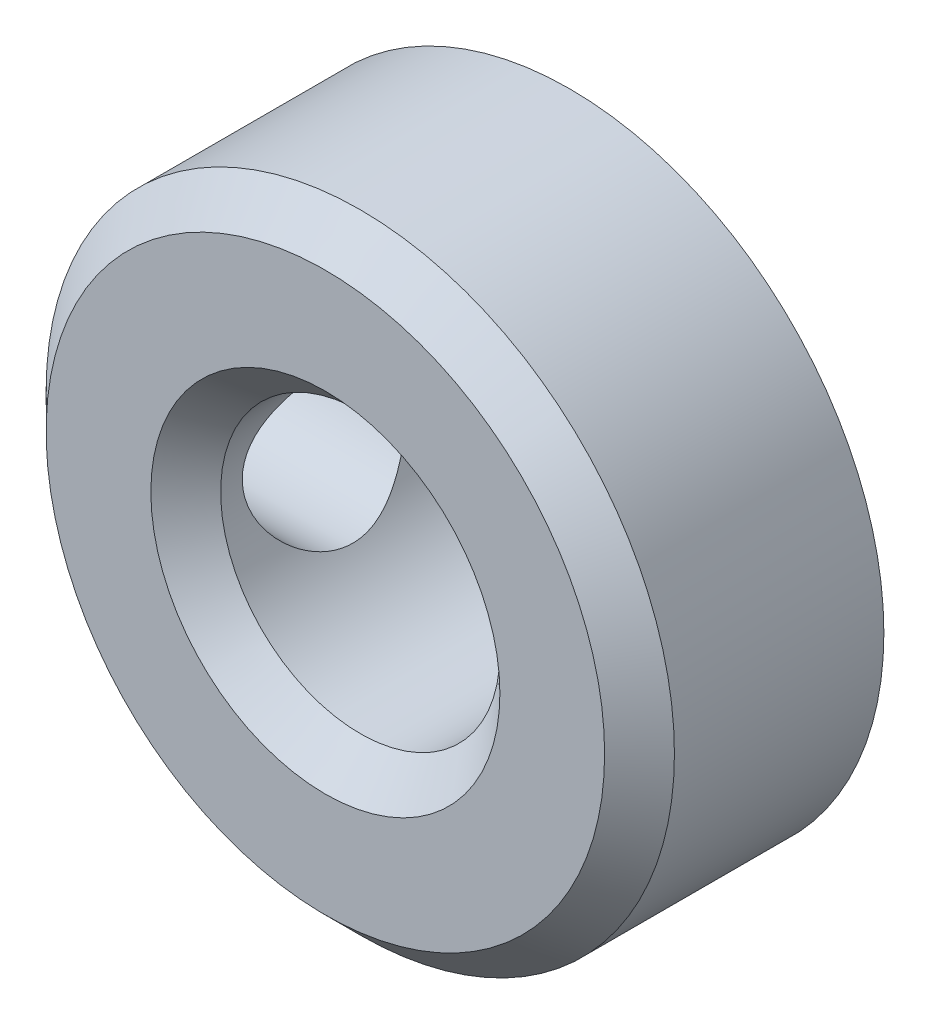
ISO-10303-21;
HEADER;
FILE_DESCRIPTION(('STEP AP214'),'2;1');
FILE_NAME('part.step','',(''),(''),'','','');
FILE_SCHEMA(('AUTOMOTIVE_DESIGN { 1 0 10303 214 1 1 1 1 }'));
ENDSEC;
DATA;
#1=APPLICATION_CONTEXT('core data for automotive mechanical design processes');
#2=APPLICATION_PROTOCOL_DEFINITION('international standard','automotive_design',2000,#1);
#3=PRODUCT_CONTEXT('',#1,'mechanical');
#4=PRODUCT('Part','Part','',(#3));
#5=PRODUCT_RELATED_PRODUCT_CATEGORY('part','',(#4));
#6=PRODUCT_DEFINITION_FORMATION('','',#4);
#7=PRODUCT_DEFINITION_CONTEXT('part definition',#1,'design');
#8=PRODUCT_DEFINITION('design','',#6,#7);
#9=PRODUCT_DEFINITION_SHAPE('','',#8);
#10=(LENGTH_UNIT() NAMED_UNIT(*) SI_UNIT(.MILLI.,.METRE.));
#11=(NAMED_UNIT(*) PLANE_ANGLE_UNIT() SI_UNIT($,.RADIAN.));
#12=(NAMED_UNIT(*) SI_UNIT($,.STERADIAN.) SOLID_ANGLE_UNIT());
#13=UNCERTAINTY_MEASURE_WITH_UNIT(LENGTH_MEASURE(1.E-05),#10,'distance_accuracy_value','');
#14=(GEOMETRIC_REPRESENTATION_CONTEXT(3) GLOBAL_UNCERTAINTY_ASSIGNED_CONTEXT((#13)) GLOBAL_UNIT_ASSIGNED_CONTEXT((#10,
#11,#12)) REPRESENTATION_CONTEXT('',''));
#15=CARTESIAN_POINT('',(0.,0.,0.));
#16=DIRECTION('',(0.,0.,1.));
#17=DIRECTION('',(1.,0.,0.));
#18=AXIS2_PLACEMENT_3D('',#15,#16,#17);
#19=CARTESIAN_POINT('',(0.,0.,8.));
#20=DIRECTION('',(0.,0.,-1.));
#21=DIRECTION('',(-1.,0.,0.));
#22=AXIS2_PLACEMENT_3D('',#19,#20,#21);
#23=CYLINDRICAL_SURFACE('',#22,9.);
#24=CARTESIAN_POINT('',(0.,0.,6.99999999999999));
#25=DIRECTION('',(0.,0.,1.));
#26=DIRECTION('',(1.,0.,0.));
#27=AXIS2_PLACEMENT_3D('',#24,#25,#26);
#28=CIRCLE('',#27,9.);
#29=CARTESIAN_POINT('',(9.,0.,6.99999999999999));
#30=VERTEX_POINT('',#29);
#31=EDGE_CURVE('E10',#30,#30,#28,.F.);
#32=ORIENTED_EDGE('',*,*,#31,.T.);
#33=EDGE_LOOP('',(#32));
#34=FACE_BOUND('',#33,.T.);
#35=CARTESIAN_POINT('',(-9.,0.,6.38125));
#36=CARTESIAN_POINT('',(-8.99999798467923,-0.131309512700447,6.38124680600626));
#37=CARTESIAN_POINT('',(-8.99709797693568,-0.262653431981833,6.37035235001869));
#38=CARTESIAN_POINT('',(-8.98581083004397,-0.521560103785591,6.32713797945013));
#39=CARTESIAN_POINT('',(-8.97742099033645,-0.649120963044646,6.2948075199616));
#40=CARTESIAN_POINT('',(-8.95608058484247,-0.896686674551814,6.20984396750576));
#41=CARTESIAN_POINT('',(-8.94313584980798,-1.01670095679463,6.15723682268507));
#42=CARTESIAN_POINT('',(-8.91405503505782,-1.24620286456261,6.03330879169303));
#43=CARTESIAN_POINT('',(-8.89791875589815,-1.35568983158557,5.96198673591009));
#44=CARTESIAN_POINT('',(-8.86378587503302,-1.56353159494066,5.80093229414223));
#45=CARTESIAN_POINT('',(-8.84575786636026,-1.66161149651998,5.71085180228003));
#46=CARTESIAN_POINT('',(-8.81007595044559,-1.84146318742849,5.51558183402106));
#47=CARTESIAN_POINT('',(-8.79242209082722,-1.92323291172778,5.41039044733199));
#48=CARTESIAN_POINT('',(-8.75916663935108,-2.06947735177871,5.18569812037626));
#49=CARTESIAN_POINT('',(-8.74360470478374,-2.13363694374975,5.06598566916805));
#50=CARTESIAN_POINT('',(-8.71675637581681,-2.24081055932566,4.81699475981791));
#51=CARTESIAN_POINT('',(-8.70546920674695,-2.2838284146436,4.68771803998729));
#52=CARTESIAN_POINT('',(-8.68877245569261,-2.34654490217524,4.42630996317418));
#53=CARTESIAN_POINT('',(-8.68323760502427,-2.36674141004057,4.29430625042168));
#54=CARTESIAN_POINT('',(-8.67829781106524,-2.38479392005639,4.02867712268295));
#55=CARTESIAN_POINT('',(-8.6788917416541,-2.3826540263627,3.89505201012428));
#56=CARTESIAN_POINT('',(-8.68603022260516,-2.3564899925805,3.63385019360108));
#57=CARTESIAN_POINT('',(-8.69241127288658,-2.33306711386461,3.50620808516409));
#58=CARTESIAN_POINT('',(-8.71014337361605,-2.26596450264241,3.25673312843764));
#59=CARTESIAN_POINT('',(-8.72149481576193,-2.22228317362796,3.13490073882947));
#60=CARTESIAN_POINT('',(-8.74803325290006,-2.11541080670698,2.89893057400899));
#61=CARTESIAN_POINT('',(-8.76326153222618,-2.05200803264609,2.7848935344326));
#62=CARTESIAN_POINT('',(-8.79581546551979,-1.90764030861978,2.56886549653931));
#63=CARTESIAN_POINT('',(-8.81314152624478,-1.82667195028932,2.46687684198957));
#64=CARTESIAN_POINT('',(-8.84862038992559,-1.64639200625548,2.27440406675599));
#65=CARTESIAN_POINT('',(-8.86678188179102,-1.54657519157148,2.18439411477061));
#66=CARTESIAN_POINT('',(-8.90138635754901,-1.33304239063562,2.0222948209667));
#67=CARTESIAN_POINT('',(-8.91782927577002,-1.21932587359689,1.95020616382641));
#68=CARTESIAN_POINT('',(-8.94724248983319,-0.980494779368565,1.82579151348282));
#69=CARTESIAN_POINT('',(-8.96019783897886,-0.855334129185483,1.77355019916559));
#70=CARTESIAN_POINT('',(-8.98106808625492,-0.597586038622827,1.69098629199859));
#71=CARTESIAN_POINT('',(-8.98898406806392,-0.465000201651199,1.66065898651394));
#72=CARTESIAN_POINT('',(-8.99872023089597,-0.20021295708475,1.62352587102549));
#73=CARTESIAN_POINT('',(-9.00070747280843,-0.068107981782415,1.6160752571067));
#74=CARTESIAN_POINT('',(-8.9988419816029,0.195463543692784,1.62312787560673));
#75=CARTESIAN_POINT('',(-8.99498984200853,0.326930157387207,1.63762887682974));
#76=CARTESIAN_POINT('',(-8.98198621698853,0.583199495276736,1.68764385874222));
#77=CARTESIAN_POINT('',(-8.97292523384685,0.708077226764481,1.72279919971514));
#78=CARTESIAN_POINT('',(-8.95053084454883,0.950151409827949,1.81270933541478));
#79=CARTESIAN_POINT('',(-8.93719697916367,1.06734703413621,1.86746623689703));
#80=CARTESIAN_POINT('',(-8.90734330517237,1.29324342410255,1.99622801978617));
#81=CARTESIAN_POINT('',(-8.89076681518221,1.40173580723558,2.07058501343687));
#82=CARTESIAN_POINT('',(-8.85634456348238,1.60492974163901,2.23599265359204));
#83=CARTESIAN_POINT('',(-8.83849855552232,1.6996286064433,2.32704654425329));
#84=CARTESIAN_POINT('',(-8.80293565173746,1.87525684150852,2.52627056092894));
#85=CARTESIAN_POINT('',(-8.78523605750331,1.95573158900402,2.63484528859086));
#86=CARTESIAN_POINT('',(-8.7525150009675,2.09732748014895,2.86433116060466));
#87=CARTESIAN_POINT('',(-8.73749342563698,2.15844944068966,2.985241783967));
#88=CARTESIAN_POINT('',(-8.71200120348031,2.25914459567467,3.23535666717522));
#89=CARTESIAN_POINT('',(-8.70150415364431,2.29884315939881,3.36450761797379));
#90=CARTESIAN_POINT('',(-8.68624103586922,2.35586598469381,3.62797610979553));
#91=CARTESIAN_POINT('',(-8.68147353110169,2.37319585586117,3.76229234676944));
#92=CARTESIAN_POINT('',(-8.67832799191096,2.38467041189116,4.02762793960445));
#93=CARTESIAN_POINT('',(-8.67974872878607,2.37954525488502,4.15861381066844));
#94=CARTESIAN_POINT('',(-8.68834921073481,2.34794604924517,4.41778207710616));
#95=CARTESIAN_POINT('',(-8.69552881196033,2.32147253386245,4.54596454242275));
#96=CARTESIAN_POINT('',(-8.7147192453937,2.24834834971492,4.79498445190391));
#97=CARTESIAN_POINT('',(-8.72669352970157,2.20185012304782,4.91586967440696));
#98=CARTESIAN_POINT('',(-8.75412553000923,2.09011504599893,5.14821395753877));
#99=CARTESIAN_POINT('',(-8.76958378451468,2.02487529837419,5.25967155730468));
#100=CARTESIAN_POINT('',(-8.8028020040912,1.87528643544959,5.47348752758714));
#101=CARTESIAN_POINT('',(-8.82061572187863,1.79043797691884,5.57548824582294));
#102=CARTESIAN_POINT('',(-8.85623493459799,1.60499290307578,5.76404097113531));
#103=CARTESIAN_POINT('',(-8.87404042649127,1.50439247658211,5.85058922862152));
#104=CARTESIAN_POINT('',(-8.90808314195951,1.28775471068826,6.00756161823786));
#105=CARTESIAN_POINT('',(-8.92427967284217,1.17143801219426,6.07760977086511));
#106=CARTESIAN_POINT('',(-8.95283657162124,0.928255978318962,6.19704710707584));
#107=CARTESIAN_POINT('',(-8.96519943695932,0.801397578926832,6.24644974750413));
#108=CARTESIAN_POINT('',(-8.98306775789566,0.562481525950002,6.31663518079908));
#109=CARTESIAN_POINT('',(-8.98937142182208,0.451468120319509,6.3408099679094));
#110=CARTESIAN_POINT('',(-8.99783821620418,0.226978221393998,6.37311799207626));
#111=CARTESIAN_POINT('',(-9.00000174201291,0.113501964330082,6.38125276084006));
#112=CARTESIAN_POINT('',(-9.,0.,6.38125));
#113=B_SPLINE_CURVE_WITH_KNOTS('',3,(#35,#36,#37,#38,#39,#40,#41,#42,#43,#44,#45,#46,#47,#48,
#49,#50,#51,#52,#53,#54,#55,#56,#57,#58,#59,#60,#61,#62,#63,#64,#65,#66,#67,#68,#69,#70,#71,#72,
#73,#74,#75,#76,#77,#78,#79,#80,#81,#82,#83,#84,#85,#86,#87,#88,#89,#90,#91,#92,#93,#94,#95,#96,
#97,#98,#99,#100,#101,#102,#103,#104,#105,#106,#107,#108,#109,#110,#111,#112),.UNSPECIFIED.,.T.,
.F.,(4,2,2,2,2,2,2,2,2,2,2,2,2,2,2,2,2,2,2,2,2,2,2,2,2,2,2,2,2,2,2,2,2,2,2,2,2,2,4),(0.,
0.393512335658052,0.787218393665488,1.1804222884957,1.57365076294676,1.97495736628762,
2.37631474681103,2.78444473903164,3.19250073476444,3.59147139424993,3.99036874698892,
4.37833583226254,4.76633349726327,5.15864966422587,5.55104202305077,5.9560254601377,
6.36102436713076,6.76773230312079,7.17435275001183,7.56940177878034,7.96441065685605,
8.35275529770095,8.74114168996564,9.13704712407248,9.53302956307465,9.93999208955149,
10.3469374356362,10.7514747851796,11.1559106655611,11.5472950577035,11.9386696739347,
12.3271161272502,12.7156226626657,13.1153968559042,13.5152679242126,13.9235201952973,
14.3315059489639,14.6716845690367,15.0118307029059),.UNSPECIFIED.);
#114=CARTESIAN_POINT('',(-9.,0.,6.38125));
#115=VERTEX_POINT('',#114);
#116=EDGE_CURVE('E53',#115,#115,#113,.T.);
#117=ORIENTED_EDGE('',*,*,#116,.T.);
#118=EDGE_LOOP('',(#117));
#119=FACE_BOUND('',#118,.T.);
#120=CARTESIAN_POINT('',(0.,0.,1.));
#121=DIRECTION('',(0.,0.,-1.));
#122=DIRECTION('',(-1.,0.,0.));
#123=AXIS2_PLACEMENT_3D('',#120,#121,#122);
#124=CIRCLE('',#123,9.);
#125=CARTESIAN_POINT('',(-9.,0.,1.));
#126=VERTEX_POINT('',#125);
#127=EDGE_CURVE('E35',#126,#126,#124,.T.);
#128=ORIENTED_EDGE('',*,*,#127,.F.);
#129=EDGE_LOOP('',(#128));
#130=FACE_BOUND('',#129,.T.);
#131=ADVANCED_FACE('F31',(#34,#119,#130),#23,.T.);
#132=CARTESIAN_POINT('',(0.,0.,0.));
#133=DIRECTION('',(0.,0.,1.));
#134=DIRECTION('',(1.,0.,0.));
#135=AXIS2_PLACEMENT_3D('',#132,#133,#134);
#136=PLANE('',#135);
#137=CARTESIAN_POINT('',(0.,0.,0.));
#138=DIRECTION('',(0.,0.,1.));
#139=DIRECTION('',(1.,0.,0.));
#140=AXIS2_PLACEMENT_3D('',#137,#138,#139);
#141=CIRCLE('',#140,4.);
#142=CARTESIAN_POINT('',(4.,0.,0.));
#143=VERTEX_POINT('',#142);
#144=EDGE_CURVE('E72',#143,#143,#141,.T.);
#145=ORIENTED_EDGE('',*,*,#144,.T.);
#146=EDGE_LOOP('',(#145));
#147=FACE_BOUND('',#146,.T.);
#148=CARTESIAN_POINT('',(0.,0.,0.));
#149=DIRECTION('',(0.,0.,-1.));
#150=DIRECTION('',(-1.,0.,0.));
#151=AXIS2_PLACEMENT_3D('',#148,#149,#150);
#152=CIRCLE('',#151,5.5);
#153=CARTESIAN_POINT('',(-5.5,0.,0.));
#154=VERTEX_POINT('',#153);
#155=EDGE_CURVE('E73',#154,#154,#152,.T.);
#156=ORIENTED_EDGE('',*,*,#155,.T.);
#157=EDGE_LOOP('',(#156));
#158=FACE_BOUND('',#157,.T.);
#159=ADVANCED_FACE('F79',(#147,#158),#136,.F.);
#160=CARTESIAN_POINT('',(0.,0.,8.));
#161=DIRECTION('',(0.,0.,1.));
#162=DIRECTION('',(1.,0.,0.));
#163=AXIS2_PLACEMENT_3D('',#160,#161,#162);
#164=PLANE('',#163);
#165=CARTESIAN_POINT('',(0.,0.,8.));
#166=DIRECTION('',(0.,0.,1.));
#167=DIRECTION('',(1.,0.,0.));
#168=AXIS2_PLACEMENT_3D('',#165,#166,#167);
#169=CIRCLE('',#168,5.);
#170=CARTESIAN_POINT('',(5.,0.,8.));
#171=VERTEX_POINT('',#170);
#172=EDGE_CURVE('E39',#171,#171,#169,.F.);
#173=ORIENTED_EDGE('',*,*,#172,.T.);
#174=EDGE_LOOP('',(#173));
#175=FACE_BOUND('',#174,.T.);
#176=CARTESIAN_POINT('',(0.,0.,8.));
#177=DIRECTION('',(0.,0.,1.));
#178=DIRECTION('',(1.,0.,0.));
#179=AXIS2_PLACEMENT_3D('',#176,#177,#178);
#180=CIRCLE('',#179,8.);
#181=CARTESIAN_POINT('',(8.,0.,8.));
#182=VERTEX_POINT('',#181);
#183=EDGE_CURVE('E44',#182,#182,#180,.T.);
#184=ORIENTED_EDGE('',*,*,#183,.T.);
#185=EDGE_LOOP('',(#184));
#186=FACE_BOUND('',#185,.T.);
#187=ADVANCED_FACE('F88',(#175,#186),#164,.T.);
#188=CARTESIAN_POINT('',(0.,0.,0.));
#189=DIRECTION('',(0.,0.,1.));
#190=DIRECTION('',(1.,0.,0.));
#191=AXIS2_PLACEMENT_3D('',#188,#189,#190);
#192=CYLINDRICAL_SURFACE('',#191,4.);
#193=CARTESIAN_POINT('',(-4.,0.,1.61875));
#194=CARTESIAN_POINT('',(-3.99999369378841,-0.121958600225183,1.61875698322153));
#195=CARTESIAN_POINT('',(-3.99436069014862,-0.244125117407285,1.62818592464262));
#196=CARTESIAN_POINT('',(-3.97236243725251,-0.484793925786397,1.66542654434116));
#197=CARTESIAN_POINT('',(-3.95596967668415,-0.603286006399093,1.69328534684155));
#198=CARTESIAN_POINT('',(-3.91411438809382,-0.832602961721493,1.76583043471108));
#199=CARTESIAN_POINT('',(-3.88869681963782,-0.943462648203384,1.81043336658574));
#200=CARTESIAN_POINT('',(-3.83096469095443,-1.15578153768284,1.91468884699302));
#201=CARTESIAN_POINT('',(-3.79865202527439,-1.25724331195962,1.97433726233655));
#202=CARTESIAN_POINT('',(-3.72697995714876,-1.45659579177148,2.11202473230114));
#203=CARTESIAN_POINT('',(-3.68727205516771,-1.55363272540422,2.19111513925831));
#204=CARTESIAN_POINT('',(-3.60602212206654,-1.73389827955767,2.36308361960366));
#205=CARTESIAN_POINT('',(-3.56447781002765,-1.81710908031897,2.45597919822147));
#206=CARTESIAN_POINT('',(-3.47832030641693,-1.97750527558543,2.66608145821015));
#207=CARTESIAN_POINT('',(-3.43393897531166,-2.05276228028645,2.78486831925077));
#208=CARTESIAN_POINT('',(-3.35334059339849,-2.18195565280467,3.03601018241924));
#209=CARTESIAN_POINT('',(-3.31711045520674,-2.23592630401134,3.16834293116548));
#210=CARTESIAN_POINT('',(-3.26595956395419,-2.30976739524217,3.41065538436466));
#211=CARTESIAN_POINT('',(-3.24801878828201,-2.33469783255785,3.51845315718316));
#212=CARTESIAN_POINT('',(-3.22283819757894,-2.36934402765734,3.7376405962254));
#213=CARTESIAN_POINT('',(-3.2155853978142,-2.37907824805521,3.84902573571093));
#214=CARTESIAN_POINT('',(-3.21284875339884,-2.38277374175419,4.07241267826898));
#215=CARTESIAN_POINT('',(-3.21738672407944,-2.37670577774219,4.18441524126434));
#216=CARTESIAN_POINT('',(-3.2375797595125,-2.34911771373285,4.40549882301283));
#217=CARTESIAN_POINT('',(-3.25324307317872,-2.32758614807703,4.51457761161286));
#218=CARTESIAN_POINT('',(-3.2933070673423,-2.27053105779421,4.72587617289746));
#219=CARTESIAN_POINT('',(-3.31760725149628,-2.23516801590084,4.82815941007846));
#220=CARTESIAN_POINT('',(-3.37231704842719,-2.15173440750367,5.02561872879113));
#221=CARTESIAN_POINT('',(-3.40272891630919,-2.10365914833893,5.12079216909798));
#222=CARTESIAN_POINT('',(-3.47257750699471,-1.98660680167754,5.31877027959702));
#223=CARTESIAN_POINT('',(-3.51266609389823,-1.91545474640143,5.42005967193438));
#224=CARTESIAN_POINT('',(-3.59378713886517,-1.75855157937792,5.61030066784138));
#225=CARTESIAN_POINT('',(-3.63482045275766,-1.67278674054539,5.69924052649576));
#226=CARTESIAN_POINT('',(-3.71973092620467,-1.47534894296906,5.87440281104479));
#227=CARTESIAN_POINT('',(-3.76324489266786,-1.36174169352291,5.95863979168564));
#228=CARTESIAN_POINT('',(-3.84232965901654,-1.11923308120515,6.1065995006607));
#229=CARTESIAN_POINT('',(-3.87790486307723,-0.990340259375996,6.17033361205048));
#230=CARTESIAN_POINT('',(-3.92121599187469,-0.792634721214294,6.2464796723261));
#231=CARTESIAN_POINT('',(-3.93369870132938,-0.728301213430327,6.26816483818487));
#232=CARTESIAN_POINT('',(-3.95566759597619,-0.597556788482511,6.30605715237176));
#233=CARTESIAN_POINT('',(-3.96515544790605,-0.531147049509393,6.32226734805563));
#234=CARTESIAN_POINT('',(-3.98083896071931,-0.396846957978224,6.34894591835822));
#235=CARTESIAN_POINT('',(-3.98703693767864,-0.328957682162555,6.35941833254974));
#236=CARTESIAN_POINT('',(-3.99596140180067,-0.192326797785503,6.37446683071159));
#237=CARTESIAN_POINT('',(-3.99868835946514,-0.123585306019062,6.37904371383084));
#238=CARTESIAN_POINT('',(-4.00124862215164,0.0645145581396675,6.38335247969909));
#239=CARTESIAN_POINT('',(-3.99750831681022,0.184132610787516,6.37709499684331));
#240=CARTESIAN_POINT('',(-3.97963074684662,0.420228505541418,6.34690266304553));
#241=CARTESIAN_POINT('',(-3.9654936181476,0.536706388679926,6.32296804320607));
#242=CARTESIAN_POINT('',(-3.92855829840756,0.760964723234018,6.2593307654475));
#243=CARTESIAN_POINT('',(-3.90595567636818,0.868879439045431,6.21998329668703));
#244=CARTESIAN_POINT('',(-3.85389301833341,1.07656350381283,6.12704534512903));
#245=CARTESIAN_POINT('',(-3.82443158507388,1.17633118746927,6.07345195986431));
#246=CARTESIAN_POINT('',(-3.75746484704058,1.37610966640757,5.94731774333134));
#247=CARTESIAN_POINT('',(-3.71944160984087,1.47506639409267,5.87338594336486));
#248=CARTESIAN_POINT('',(-3.64071046244616,1.65992348312927,5.71175628106745));
#249=CARTESIAN_POINT('',(-3.59999945376433,1.74580838459035,5.62404236405791));
#250=CARTESIAN_POINT('',(-3.51413307441088,1.91332292853124,5.42430302686424));
#251=CARTESIAN_POINT('',(-3.46907187413721,1.99301818698482,5.31060411370967));
#252=CARTESIAN_POINT('',(-3.38531786114038,2.1321898460662,5.06932551488871));
#253=CARTESIAN_POINT('',(-3.34661800864266,2.19168867579383,4.94176143646042));
#254=CARTESIAN_POINT('',(-3.28864859291092,2.27747087416069,4.70412984264949));
#255=CARTESIAN_POINT('',(-3.26698729896045,2.30815382675368,4.59623982294853));
#256=CARTESIAN_POINT('',(-3.23403899727427,2.35410496511814,4.37574232574183));
#257=CARTESIAN_POINT('',(-3.2227380113016,2.36939392337674,4.26314141946832));
#258=CARTESIAN_POINT('',(-3.21216974492394,2.38370635384045,4.03593066738034));
#259=CARTESIAN_POINT('',(-3.21294385289347,2.38267388284625,3.92131525770332));
#260=CARTESIAN_POINT('',(-3.22650465067388,2.36427281537815,3.69410275009601));
#261=CARTESIAN_POINT('',(-3.2392981540156,2.34689495305498,3.58150683386927));
#262=CARTESIAN_POINT('',(-3.27421225909472,2.29790707236039,3.36623761851658));
#263=CARTESIAN_POINT('',(-3.29591163584406,2.26693589629596,3.2633459296409));
#264=CARTESIAN_POINT('',(-3.346077585527,2.19220967150133,3.06410300536456));
#265=CARTESIAN_POINT('',(-3.37454669696915,2.14844982587526,2.96775424088834));
#266=CARTESIAN_POINT('',(-3.4403859965985,2.04163015510146,2.76842167504586));
#267=CARTESIAN_POINT('',(-3.47845181021323,1.97663440588361,2.66670718175512));
#268=CARTESIAN_POINT('',(-3.55650338717209,1.83248693424712,2.47462164345148));
#269=CARTESIAN_POINT('',(-3.59649069792858,1.75332365785148,2.38425996008785));
#270=CARTESIAN_POINT('',(-3.68126167645541,1.56850392369005,2.20293724395685));
#271=CARTESIAN_POINT('',(-3.72581491423305,1.46063980056998,2.11410159850531));
#272=CARTESIAN_POINT('',(-3.80845433046879,1.22911611964279,1.95567966675957));
#273=CARTESIAN_POINT('',(-3.84653844462053,1.10545154186297,1.88609952048233));
#274=CARTESIAN_POINT('',(-3.89499506250918,0.912813158182012,1.79957526400827));
#275=CARTESIAN_POINT('',(-3.90951305656635,0.848630616033845,1.77401955419055));
#276=CARTESIAN_POINT('',(-3.93563776933083,0.717769248138124,1.72844804162206));
#277=CARTESIAN_POINT('',(-3.94724618409084,0.65109190283792,1.70842901072168));
#278=CARTESIAN_POINT('',(-3.96716698801715,0.515983142342694,1.6742836779811));
#279=CARTESIAN_POINT('',(-3.9754890954039,0.447557545831764,1.66013999510333));
#280=CARTESIAN_POINT('',(-3.9886154014844,0.309436228457367,1.63790650811232));
#281=CARTESIAN_POINT('',(-3.99342259066377,0.239741639120743,1.62981155762024));
#282=CARTESIAN_POINT('',(-3.99759504406868,0.141541801943804,1.62279161231318));
#283=CARTESIAN_POINT('',(-3.99849597287652,0.11326341726277,1.62127699962549));
#284=CARTESIAN_POINT('',(-3.99969919141728,0.0566604304362782,1.61925536879188));
#285=CARTESIAN_POINT('',(-4.00000146518344,0.0283358270782847,1.61874837752026));
#286=CARTESIAN_POINT('',(-4.,0.,1.61875));
#287=B_SPLINE_CURVE_WITH_KNOTS('',3,(#193,#194,#195,#196,#197,#198,#199,#200,#201,#202,#203,
#204,#205,#206,#207,#208,#209,#210,#211,#212,#213,#214,#215,#216,#217,#218,#219,#220,#221,#222,
#223,#224,#225,#226,#227,#228,#229,#230,#231,#232,#233,#234,#235,#236,#237,#238,#239,#240,#241,
#242,#243,#244,#245,#246,#247,#248,#249,#250,#251,#252,#253,#254,#255,#256,#257,#258,#259,#260,
#261,#262,#263,#264,#265,#266,#267,#268,#269,#270,#271,#272,#273,#274,#275,#276,#277,#278,#279,
#280,#281,#282,#283,#284,#285,#286),.UNSPECIFIED.,.T.,.F.,(4,2,2,2,2,2,2,2,2,2,2,2,2,2,2,2,2,2,
2,2,2,2,2,2,2,2,2,2,2,2,2,2,2,2,2,2,2,2,2,2,2,2,2,2,2,2,4),(0.,0.365760190979621,
0.732459245863993,1.09735654473908,1.46215371056954,1.85460485093189,2.24755794160591,
2.68777271576939,3.12727556462002,3.46211079513695,3.79653890076374,4.13158620705445,
4.46688219469283,4.79839804008203,5.13003643439473,5.51887798195501,5.90808683739068,
6.34980485010281,6.79127719898705,6.99810377309616,7.20481503756536,7.41138058339516,
7.61791812597857,7.97546974456659,8.33301668877678,8.68276759449319,9.03258981325193,
9.41879804459119,9.80545954857302,10.2413563800383,10.67676753122,11.0180705862967,
11.3589124710529,11.7009228752577,12.0431272746953,12.3707316452061,12.698459054742,
13.0767431058971,13.4553370748555,13.8932633310951,14.3313290687611,14.5428417394047,
14.7542308267726,14.9649900302419,15.1755697108725,15.2605480649531,15.3455286854635),.UNSPECIFIED.);
#288=CARTESIAN_POINT('',(-4.,0.,1.61875));
#289=VERTEX_POINT('',#288);
#290=EDGE_CURVE('E47',#289,#289,#287,.T.);
#291=ORIENTED_EDGE('',*,*,#290,.T.);
#292=EDGE_LOOP('',(#291));
#293=FACE_BOUND('',#292,.T.);
#294=CARTESIAN_POINT('',(0.,0.,7.));
#295=DIRECTION('',(0.,0.,1.));
#296=DIRECTION('',(1.,0.,0.));
#297=AXIS2_PLACEMENT_3D('',#294,#295,#296);
#298=CIRCLE('',#297,4.);
#299=CARTESIAN_POINT('',(4.,0.,7.));
#300=VERTEX_POINT('',#299);
#301=EDGE_CURVE('E94',#300,#300,#298,.T.);
#302=ORIENTED_EDGE('',*,*,#301,.T.);
#303=EDGE_LOOP('',(#302));
#304=FACE_BOUND('',#303,.T.);
#305=ORIENTED_EDGE('',*,*,#144,.F.);
#306=EDGE_LOOP('',(#305));
#307=FACE_BOUND('',#306,.T.);
#308=ADVANCED_FACE('F54',(#293,#304,#307),#192,.F.);
#309=CARTESIAN_POINT('',(0.,0.,7.));
#310=DIRECTION('',(0.,0.,1.));
#311=DIRECTION('',(1.,0.,0.));
#312=AXIS2_PLACEMENT_3D('',#309,#310,#311);
#313=CONICAL_SURFACE('',#312,4.,0.78539816339745);
#314=ORIENTED_EDGE('',*,*,#172,.F.);
#315=EDGE_LOOP('',(#314));
#316=FACE_BOUND('',#315,.T.);
#317=ORIENTED_EDGE('',*,*,#301,.F.);
#318=EDGE_LOOP('',(#317));
#319=FACE_BOUND('',#318,.T.);
#320=ADVANCED_FACE('F80',(#316,#319),#313,.F.);
#321=CARTESIAN_POINT('',(0.,0.,8.));
#322=DIRECTION('',(0.,0.,-1.));
#323=DIRECTION('',(-1.,0.,0.));
#324=AXIS2_PLACEMENT_3D('',#321,#322,#323);
#325=CONICAL_SURFACE('',#324,8.,0.785398163397447);
#326=ORIENTED_EDGE('',*,*,#31,.F.);
#327=EDGE_LOOP('',(#326));
#328=FACE_BOUND('',#327,.T.);
#329=ORIENTED_EDGE('',*,*,#183,.F.);
#330=EDGE_LOOP('',(#329));
#331=FACE_BOUND('',#330,.T.);
#332=ADVANCED_FACE('F33',(#328,#331),#325,.T.);
#333=CARTESIAN_POINT('',(-10.,0.,4.));
#334=DIRECTION('',(1.,0.,0.));
#335=DIRECTION('',(0.,0.,-1.));
#336=AXIS2_PLACEMENT_3D('',#333,#334,#335);
#337=CYLINDRICAL_SURFACE('',#336,2.38125);
#338=ORIENTED_EDGE('',*,*,#290,.F.);
#339=EDGE_LOOP('',(#338));
#340=FACE_BOUND('',#339,.T.);
#341=ORIENTED_EDGE('',*,*,#116,.F.);
#342=EDGE_LOOP('',(#341));
#343=FACE_BOUND('',#342,.T.);
#344=ADVANCED_FACE('F57',(#340,#343),#337,.F.);
#345=CARTESIAN_POINT('',(0.,0.,1.));
#346=DIRECTION('',(0.,0.,-1.));
#347=DIRECTION('',(-1.,0.,0.));
#348=AXIS2_PLACEMENT_3D('',#345,#346,#347);
#349=PLANE('',#348);
#350=CARTESIAN_POINT('',(0.,0.,1.));
#351=DIRECTION('',(0.,0.,-1.));
#352=DIRECTION('',(-1.,0.,0.));
#353=AXIS2_PLACEMENT_3D('',#350,#351,#352);
#354=CIRCLE('',#353,5.5);
#355=CARTESIAN_POINT('',(-5.5,0.,1.));
#356=VERTEX_POINT('',#355);
#357=EDGE_CURVE('E106',#356,#356,#354,.T.);
#358=ORIENTED_EDGE('',*,*,#357,.F.);
#359=EDGE_LOOP('',(#358));
#360=FACE_BOUND('',#359,.T.);
#361=ORIENTED_EDGE('',*,*,#127,.T.);
#362=EDGE_LOOP('',(#361));
#363=FACE_BOUND('',#362,.T.);
#364=ADVANCED_FACE('F61',(#360,#363),#349,.T.);
#365=CARTESIAN_POINT('',(0.,0.,1.));
#366=DIRECTION('',(0.,0.,-1.));
#367=DIRECTION('',(-1.,0.,0.));
#368=AXIS2_PLACEMENT_3D('',#365,#366,#367);
#369=CYLINDRICAL_SURFACE('',#368,5.5);
#370=ORIENTED_EDGE('',*,*,#357,.T.);
#371=EDGE_LOOP('',(#370));
#372=FACE_BOUND('',#371,.T.);
#373=ORIENTED_EDGE('',*,*,#155,.F.);
#374=EDGE_LOOP('',(#373));
#375=FACE_BOUND('',#374,.T.);
#376=ADVANCED_FACE('F115',(#372,#375),#369,.T.);
#377=CLOSED_SHELL('',(#131,#159,#187,#308,#320,#332,#344,#364,#376));
#378=MANIFOLD_SOLID_BREP('B2',#377);
#379=ADVANCED_BREP_SHAPE_REPRESENTATION('',(#18,#378),#14);
#380=SHAPE_DEFINITION_REPRESENTATION(#9,#379);
ENDSEC;
END-ISO-10303-21;
